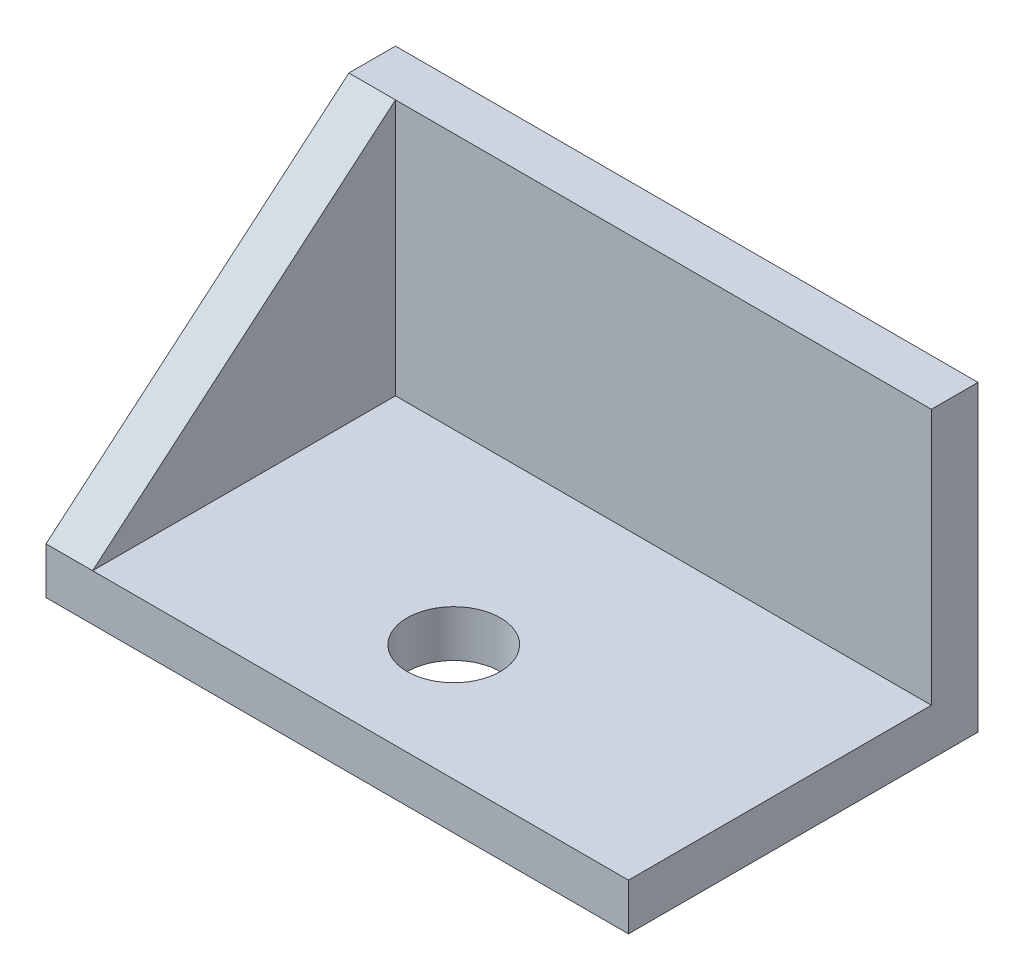
ISO-10303-21;
HEADER;
FILE_DESCRIPTION(('STEP AP214'),'2;1');
FILE_NAME('part.step','',(''),(''),'','','');
FILE_SCHEMA(('AUTOMOTIVE_DESIGN { 1 0 10303 214 1 1 1 1 }'));
ENDSEC;
DATA;
#1=APPLICATION_CONTEXT('core data for automotive mechanical design processes');
#2=APPLICATION_PROTOCOL_DEFINITION('international standard','automotive_design',2000,#1);
#3=PRODUCT_CONTEXT('',#1,'mechanical');
#4=PRODUCT('Part','Part','',(#3));
#5=PRODUCT_RELATED_PRODUCT_CATEGORY('part','',(#4));
#6=PRODUCT_DEFINITION_FORMATION('','',#4);
#7=PRODUCT_DEFINITION_CONTEXT('part definition',#1,'design');
#8=PRODUCT_DEFINITION('design','',#6,#7);
#9=PRODUCT_DEFINITION_SHAPE('','',#8);
#10=(LENGTH_UNIT() NAMED_UNIT(*) SI_UNIT(.MILLI.,.METRE.));
#11=(NAMED_UNIT(*) PLANE_ANGLE_UNIT() SI_UNIT($,.RADIAN.));
#12=(NAMED_UNIT(*) SI_UNIT($,.STERADIAN.) SOLID_ANGLE_UNIT());
#13=UNCERTAINTY_MEASURE_WITH_UNIT(LENGTH_MEASURE(1.E-05),#10,'distance_accuracy_value','');
#14=(GEOMETRIC_REPRESENTATION_CONTEXT(3) GLOBAL_UNCERTAINTY_ASSIGNED_CONTEXT((#13)) GLOBAL_UNIT_ASSIGNED_CONTEXT((#10,
#11,#12)) REPRESENTATION_CONTEXT('',''));
#15=CARTESIAN_POINT('',(0.,0.,0.));
#16=DIRECTION('',(0.,0.,1.));
#17=DIRECTION('',(1.,0.,0.));
#18=AXIS2_PLACEMENT_3D('',#15,#16,#17);
#19=CARTESIAN_POINT('',(0.,10.,0.));
#20=DIRECTION('',(0.,1.,0.));
#21=DIRECTION('',(0.,0.,1.));
#22=AXIS2_PLACEMENT_3D('',#19,#20,#21);
#23=PLANE('',#22);
#24=DIRECTION('',(0.,0.,-1.));
#25=VECTOR('',#24,1.);
#26=CARTESIAN_POINT('',(10.,10.,0.));
#27=LINE('',#26,#25);
#28=CARTESIAN_POINT('',(10.,10.,75.));
#29=VERTEX_POINT('',#28);
#30=CARTESIAN_POINT('',(10.,10.,10.));
#31=VERTEX_POINT('',#30);
#32=EDGE_CURVE('E57',#29,#31,#27,.T.);
#33=ORIENTED_EDGE('',*,*,#32,.F.);
#34=DIRECTION('',(1.,0.,0.));
#35=VECTOR('',#34,1.);
#36=CARTESIAN_POINT('',(0.,10.,75.));
#37=LINE('',#36,#35);
#38=CARTESIAN_POINT('',(125.,10.,75.));
#39=VERTEX_POINT('',#38);
#40=EDGE_CURVE('E61',#29,#39,#37,.T.);
#41=ORIENTED_EDGE('',*,*,#40,.T.);
#42=DIRECTION('',(0.,0.,-1.));
#43=VECTOR('',#42,1.);
#44=CARTESIAN_POINT('',(125.,10.,0.));
#45=LINE('',#44,#43);
#46=CARTESIAN_POINT('',(125.,10.,9.99999999999998));
#47=VERTEX_POINT('',#46);
#48=EDGE_CURVE('E117',#39,#47,#45,.T.);
#49=ORIENTED_EDGE('',*,*,#48,.T.);
#50=DIRECTION('',(-1.,0.,0.));
#51=VECTOR('',#50,1.);
#52=CARTESIAN_POINT('',(125.,10.,9.99999999999998));
#53=LINE('',#52,#51);
#54=EDGE_CURVE('E126',#47,#31,#53,.T.);
#55=ORIENTED_EDGE('',*,*,#54,.T.);
#56=EDGE_LOOP('',(#33,#41,#49,#55));
#57=FACE_BOUND('',#56,.T.);
#58=CARTESIAN_POINT('',(62.5,10.,50.));
#59=DIRECTION('',(0.,1.,0.));
#60=DIRECTION('',(0.,0.,1.));
#61=AXIS2_PLACEMENT_3D('',#58,#59,#60);
#62=CIRCLE('',#61,9.99999999999999);
#63=CARTESIAN_POINT('',(62.5,10.,60.));
#64=VERTEX_POINT('',#63);
#65=EDGE_CURVE('E109',#64,#64,#62,.T.);
#66=ORIENTED_EDGE('',*,*,#65,.F.);
#67=EDGE_LOOP('',(#66));
#68=FACE_BOUND('',#67,.T.);
#69=ADVANCED_FACE('F41',(#57,#68),#23,.T.);
#70=CARTESIAN_POINT('',(0.,10.,0.));
#71=DIRECTION('',(1.,0.,0.));
#72=DIRECTION('',(0.,0.,-1.));
#73=AXIS2_PLACEMENT_3D('',#70,#71,#72);
#74=PLANE('',#73);
#75=DIRECTION('',(0.,-1.,0.));
#76=VECTOR('',#75,1.);
#77=CARTESIAN_POINT('',(0.,10.,75.));
#78=LINE('',#77,#76);
#79=CARTESIAN_POINT('',(0.,10.,75.));
#80=VERTEX_POINT('',#79);
#81=CARTESIAN_POINT('',(0.,0.,75.));
#82=VERTEX_POINT('',#81);
#83=EDGE_CURVE('E11',#80,#82,#78,.T.);
#84=ORIENTED_EDGE('',*,*,#83,.F.);
#85=DIRECTION('',(0.,0.645942241466174,-0.763386285369115));
#86=VECTOR('',#85,1.);
#87=CARTESIAN_POINT('',(0.,42.8103448275862,36.2241379310345));
#88=LINE('',#87,#86);
#89=CARTESIAN_POINT('',(0.,65.,10.));
#90=VERTEX_POINT('',#89);
#91=EDGE_CURVE('E252',#80,#90,#88,.T.);
#92=ORIENTED_EDGE('',*,*,#91,.T.);
#93=DIRECTION('',(0.,0.,1.));
#94=VECTOR('',#93,1.);
#95=CARTESIAN_POINT('',(0.,65.,0.));
#96=LINE('',#95,#94);
#97=CARTESIAN_POINT('',(0.,65.,0.));
#98=VERTEX_POINT('',#97);
#99=EDGE_CURVE('E268',#98,#90,#96,.T.);
#100=ORIENTED_EDGE('',*,*,#99,.F.);
#101=DIRECTION('',(0.,-1.,0.));
#102=VECTOR('',#101,1.);
#103=CARTESIAN_POINT('',(0.,10.,0.));
#104=LINE('',#103,#102);
#105=CARTESIAN_POINT('',(0.,0.,0.));
#106=VERTEX_POINT('',#105);
#107=EDGE_CURVE('E102',#98,#106,#104,.T.);
#108=ORIENTED_EDGE('',*,*,#107,.T.);
#109=DIRECTION('',(0.,0.,1.));
#110=VECTOR('',#109,1.);
#111=CARTESIAN_POINT('',(0.,0.,0.));
#112=LINE('',#111,#110);
#113=EDGE_CURVE('E108',#106,#82,#112,.T.);
#114=ORIENTED_EDGE('',*,*,#113,.T.);
#115=EDGE_LOOP('',(#84,#92,#100,#108,#114));
#116=FACE_BOUND('',#115,.T.);
#117=ADVANCED_FACE('F133',(#116),#74,.F.);
#118=CARTESIAN_POINT('',(0.,10.,75.));
#119=DIRECTION('',(0.,0.,-1.));
#120=DIRECTION('',(-1.,0.,0.));
#121=AXIS2_PLACEMENT_3D('',#118,#119,#120);
#122=PLANE('',#121);
#123=DIRECTION('',(1.,0.,0.));
#124=VECTOR('',#123,1.);
#125=CARTESIAN_POINT('',(0.,0.,75.));
#126=LINE('',#125,#124);
#127=CARTESIAN_POINT('',(125.,0.,75.));
#128=VERTEX_POINT('',#127);
#129=EDGE_CURVE('E92',#82,#128,#126,.T.);
#130=ORIENTED_EDGE('',*,*,#129,.T.);
#131=DIRECTION('',(0.,-1.,0.));
#132=VECTOR('',#131,1.);
#133=CARTESIAN_POINT('',(125.,10.,75.));
#134=LINE('',#133,#132);
#135=EDGE_CURVE('E47',#39,#128,#134,.T.);
#136=ORIENTED_EDGE('',*,*,#135,.F.);
#137=ORIENTED_EDGE('',*,*,#40,.F.);
#138=EDGE_CURVE('E116',#80,#29,#37,.T.);
#139=ORIENTED_EDGE('',*,*,#138,.F.);
#140=ORIENTED_EDGE('',*,*,#83,.T.);
#141=EDGE_LOOP('',(#130,#136,#137,#139,#140));
#142=FACE_BOUND('',#141,.T.);
#143=ADVANCED_FACE('F128',(#142),#122,.F.);
#144=CARTESIAN_POINT('',(125.,10.,0.));
#145=DIRECTION('',(-1.,0.,0.));
#146=DIRECTION('',(0.,0.,1.));
#147=AXIS2_PLACEMENT_3D('',#144,#145,#146);
#148=PLANE('',#147);
#149=DIRECTION('',(0.,0.,-1.));
#150=VECTOR('',#149,1.);
#151=CARTESIAN_POINT('',(125.,0.,0.));
#152=LINE('',#151,#150);
#153=CARTESIAN_POINT('',(125.,0.,0.));
#154=VERTEX_POINT('',#153);
#155=EDGE_CURVE('E83',#128,#154,#152,.T.);
#156=ORIENTED_EDGE('',*,*,#155,.T.);
#157=DIRECTION('',(0.,-1.,0.));
#158=VECTOR('',#157,1.);
#159=CARTESIAN_POINT('',(125.,10.,0.));
#160=LINE('',#159,#158);
#161=CARTESIAN_POINT('',(125.,65.,0.));
#162=VERTEX_POINT('',#161);
#163=EDGE_CURVE('E90',#162,#154,#160,.T.);
#164=ORIENTED_EDGE('',*,*,#163,.F.);
#165=DIRECTION('',(0.,0.,1.));
#166=VECTOR('',#165,1.);
#167=CARTESIAN_POINT('',(125.,65.,0.));
#168=LINE('',#167,#166);
#169=CARTESIAN_POINT('',(125.,65.,9.99999999999998));
#170=VERTEX_POINT('',#169);
#171=EDGE_CURVE('E275',#162,#170,#168,.T.);
#172=ORIENTED_EDGE('',*,*,#171,.T.);
#173=DIRECTION('',(0.,-1.,0.));
#174=VECTOR('',#173,1.);
#175=CARTESIAN_POINT('',(125.,0.,9.99999999999998));
#176=LINE('',#175,#174);
#177=EDGE_CURVE('E267',#170,#47,#176,.T.);
#178=ORIENTED_EDGE('',*,*,#177,.T.);
#179=ORIENTED_EDGE('',*,*,#48,.F.);
#180=ORIENTED_EDGE('',*,*,#135,.T.);
#181=EDGE_LOOP('',(#156,#164,#172,#178,#179,#180));
#182=FACE_BOUND('',#181,.T.);
#183=ADVANCED_FACE('F88',(#182),#148,.F.);
#184=CARTESIAN_POINT('',(62.5,10.,50.));
#185=DIRECTION('',(0.,-1.,0.));
#186=DIRECTION('',(0.,0.,-1.));
#187=AXIS2_PLACEMENT_3D('',#184,#185,#186);
#188=CYLINDRICAL_SURFACE('',#187,9.99999999999999);
#189=ORIENTED_EDGE('',*,*,#65,.T.);
#190=EDGE_LOOP('',(#189));
#191=FACE_BOUND('',#190,.T.);
#192=CARTESIAN_POINT('',(62.5,0.,50.));
#193=DIRECTION('',(0.,1.,0.));
#194=DIRECTION('',(0.,0.,1.));
#195=AXIS2_PLACEMENT_3D('',#192,#193,#194);
#196=CIRCLE('',#195,9.99999999999999);
#197=CARTESIAN_POINT('',(62.5,0.,60.));
#198=VERTEX_POINT('',#197);
#199=EDGE_CURVE('E124',#198,#198,#196,.T.);
#200=ORIENTED_EDGE('',*,*,#199,.F.);
#201=EDGE_LOOP('',(#200));
#202=FACE_BOUND('',#201,.T.);
#203=ADVANCED_FACE('F43',(#191,#202),#188,.F.);
#204=CARTESIAN_POINT('',(0.,10.,0.));
#205=DIRECTION('',(0.,0.,1.));
#206=DIRECTION('',(1.,0.,0.));
#207=AXIS2_PLACEMENT_3D('',#204,#205,#206);
#208=PLANE('',#207);
#209=DIRECTION('',(-1.,0.,0.));
#210=VECTOR('',#209,1.);
#211=CARTESIAN_POINT('',(0.,0.,0.));
#212=LINE('',#211,#210);
#213=EDGE_CURVE('E94',#154,#106,#212,.T.);
#214=ORIENTED_EDGE('',*,*,#213,.T.);
#215=ORIENTED_EDGE('',*,*,#107,.F.);
#216=DIRECTION('',(-1.,0.,0.));
#217=VECTOR('',#216,1.);
#218=CARTESIAN_POINT('',(125.,65.,0.));
#219=LINE('',#218,#217);
#220=EDGE_CURVE('E105',#162,#98,#219,.T.);
#221=ORIENTED_EDGE('',*,*,#220,.F.);
#222=ORIENTED_EDGE('',*,*,#163,.T.);
#223=EDGE_LOOP('',(#214,#215,#221,#222));
#224=FACE_BOUND('',#223,.T.);
#225=ADVANCED_FACE('F98',(#224),#208,.F.);
#226=CARTESIAN_POINT('',(0.,0.,0.));
#227=DIRECTION('',(0.,1.,0.));
#228=DIRECTION('',(0.,0.,1.));
#229=AXIS2_PLACEMENT_3D('',#226,#227,#228);
#230=PLANE('',#229);
#231=ORIENTED_EDGE('',*,*,#199,.T.);
#232=EDGE_LOOP('',(#231));
#233=FACE_BOUND('',#232,.T.);
#234=ORIENTED_EDGE('',*,*,#113,.F.);
#235=ORIENTED_EDGE('',*,*,#213,.F.);
#236=ORIENTED_EDGE('',*,*,#155,.F.);
#237=ORIENTED_EDGE('',*,*,#129,.F.);
#238=EDGE_LOOP('',(#234,#235,#236,#237));
#239=FACE_BOUND('',#238,.T.);
#240=ADVANCED_FACE('F110',(#233,#239),#230,.F.);
#241=CARTESIAN_POINT('',(125.,0.,9.99999999999998));
#242=DIRECTION('',(0.,0.,-1.));
#243=DIRECTION('',(-1.,0.,0.));
#244=AXIS2_PLACEMENT_3D('',#241,#242,#243);
#245=PLANE('',#244);
#246=DIRECTION('',(-1.,0.,0.));
#247=VECTOR('',#246,1.);
#248=CARTESIAN_POINT('',(125.,65.,9.99999999999998));
#249=LINE('',#248,#247);
#250=CARTESIAN_POINT('',(10.,65.,10.));
#251=VERTEX_POINT('',#250);
#252=EDGE_CURVE('E273',#170,#251,#249,.T.);
#253=ORIENTED_EDGE('',*,*,#252,.T.);
#254=DIRECTION('',(0.,-1.,0.));
#255=VECTOR('',#254,1.);
#256=CARTESIAN_POINT('',(10.,0.,10.));
#257=LINE('',#256,#255);
#258=EDGE_CURVE('E264',#251,#31,#257,.T.);
#259=ORIENTED_EDGE('',*,*,#258,.T.);
#260=ORIENTED_EDGE('',*,*,#54,.F.);
#261=ORIENTED_EDGE('',*,*,#177,.F.);
#262=EDGE_LOOP('',(#253,#259,#260,#261));
#263=FACE_BOUND('',#262,.T.);
#264=ADVANCED_FACE('F149',(#263),#245,.F.);
#265=CARTESIAN_POINT('',(125.,65.,0.));
#266=DIRECTION('',(0.,-1.,0.));
#267=DIRECTION('',(0.,0.,-1.));
#268=AXIS2_PLACEMENT_3D('',#265,#266,#267);
#269=PLANE('',#268);
#270=ORIENTED_EDGE('',*,*,#99,.T.);
#271=DIRECTION('',(-1.,0.,0.));
#272=VECTOR('',#271,1.);
#273=CARTESIAN_POINT('',(10.,65.,10.));
#274=LINE('',#273,#272);
#275=EDGE_CURVE('E260',#251,#90,#274,.T.);
#276=ORIENTED_EDGE('',*,*,#275,.F.);
#277=ORIENTED_EDGE('',*,*,#252,.F.);
#278=ORIENTED_EDGE('',*,*,#171,.F.);
#279=ORIENTED_EDGE('',*,*,#220,.T.);
#280=EDGE_LOOP('',(#270,#276,#277,#278,#279));
#281=FACE_BOUND('',#280,.T.);
#282=ADVANCED_FACE('F152',(#281),#269,.F.);
#283=CARTESIAN_POINT('',(10.,42.8103448275862,36.2241379310345));
#284=DIRECTION('',(0.,0.763386285369115,0.645942241466174));
#285=DIRECTION('',(0.,-0.645942241466174,0.763386285369115));
#286=AXIS2_PLACEMENT_3D('',#283,#284,#285);
#287=PLANE('',#286);
#288=ORIENTED_EDGE('',*,*,#91,.F.);
#289=ORIENTED_EDGE('',*,*,#138,.T.);
#290=DIRECTION('',(0.,0.645942241466174,-0.763386285369115));
#291=VECTOR('',#290,1.);
#292=CARTESIAN_POINT('',(10.,42.8103448275862,36.2241379310345));
#293=LINE('',#292,#291);
#294=EDGE_CURVE('E261',#29,#251,#293,.T.);
#295=ORIENTED_EDGE('',*,*,#294,.T.);
#296=ORIENTED_EDGE('',*,*,#275,.T.);
#297=EDGE_LOOP('',(#288,#289,#295,#296));
#298=FACE_BOUND('',#297,.T.);
#299=ADVANCED_FACE('F158',(#298),#287,.T.);
#300=CARTESIAN_POINT('',(10.,0.,0.));
#301=DIRECTION('',(-1.,0.,0.));
#302=DIRECTION('',(0.,0.,1.));
#303=AXIS2_PLACEMENT_3D('',#300,#301,#302);
#304=PLANE('',#303);
#305=ORIENTED_EDGE('',*,*,#32,.T.);
#306=ORIENTED_EDGE('',*,*,#258,.F.);
#307=ORIENTED_EDGE('',*,*,#294,.F.);
#308=EDGE_LOOP('',(#305,#306,#307));
#309=FACE_BOUND('',#308,.T.);
#310=ADVANCED_FACE('F165',(#309),#304,.F.);
#311=CLOSED_SHELL('',(#69,#117,#143,#183,#203,#225,#240,#264,#282,#299,#310));
#312=MANIFOLD_SOLID_BREP('B2',#311);
#313=ADVANCED_BREP_SHAPE_REPRESENTATION('',(#18,#312),#14);
#314=SHAPE_DEFINITION_REPRESENTATION(#9,#313);
ENDSEC;
END-ISO-10303-21;
